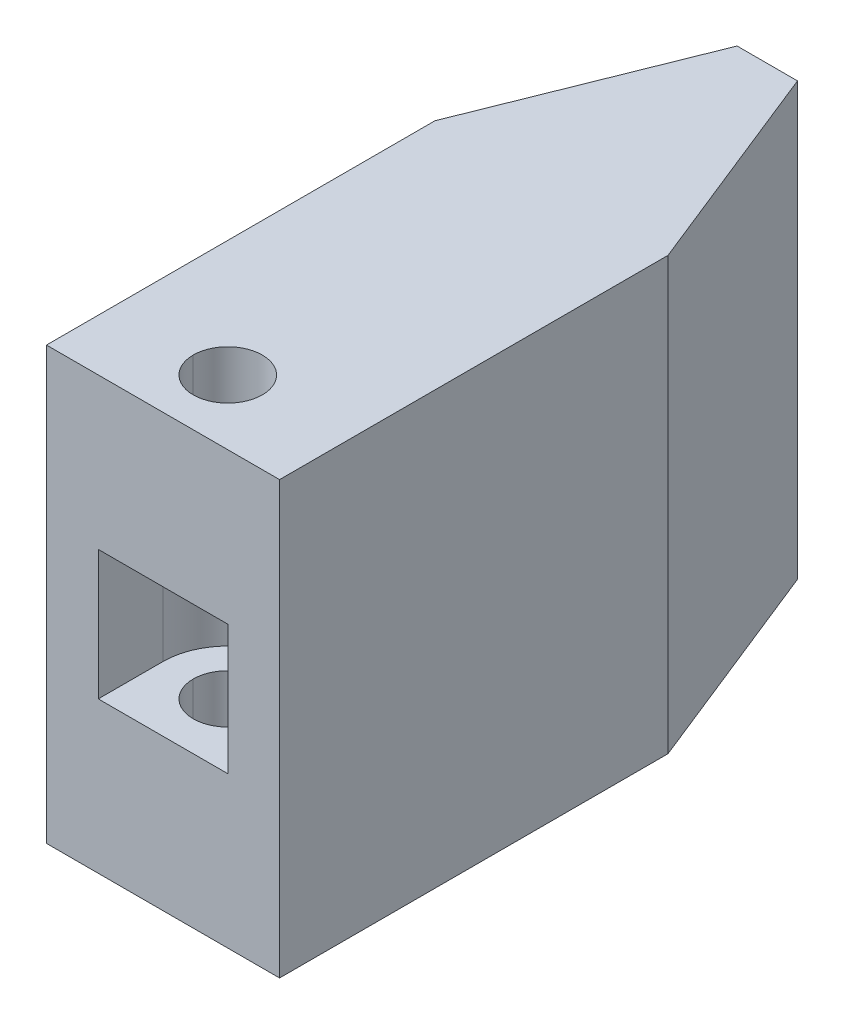
ISO-10303-21;
HEADER;
FILE_DESCRIPTION(('STEP AP214'),'2;1');
FILE_NAME('part.step','',(''),(''),'','','');
FILE_SCHEMA(('AUTOMOTIVE_DESIGN { 1 0 10303 214 1 1 1 1 }'));
ENDSEC;
DATA;
#1=APPLICATION_CONTEXT('core data for automotive mechanical design processes');
#2=APPLICATION_PROTOCOL_DEFINITION('international standard','automotive_design',2000,#1);
#3=PRODUCT_CONTEXT('',#1,'mechanical');
#4=PRODUCT('Part','Part','',(#3));
#5=PRODUCT_RELATED_PRODUCT_CATEGORY('part','',(#4));
#6=PRODUCT_DEFINITION_FORMATION('','',#4);
#7=PRODUCT_DEFINITION_CONTEXT('part definition',#1,'design');
#8=PRODUCT_DEFINITION('design','',#6,#7);
#9=PRODUCT_DEFINITION_SHAPE('','',#8);
#10=(LENGTH_UNIT() NAMED_UNIT(*) SI_UNIT(.MILLI.,.METRE.));
#11=(NAMED_UNIT(*) PLANE_ANGLE_UNIT() SI_UNIT($,.RADIAN.));
#12=(NAMED_UNIT(*) SI_UNIT($,.STERADIAN.) SOLID_ANGLE_UNIT());
#13=UNCERTAINTY_MEASURE_WITH_UNIT(LENGTH_MEASURE(1.E-05),#10,'distance_accuracy_value','');
#14=(GEOMETRIC_REPRESENTATION_CONTEXT(3) GLOBAL_UNCERTAINTY_ASSIGNED_CONTEXT((#13)) GLOBAL_UNIT_ASSIGNED_CONTEXT((#10,
#11,#12)) REPRESENTATION_CONTEXT('',''));
#15=CARTESIAN_POINT('',(0.,0.,0.));
#16=DIRECTION('',(0.,0.,1.));
#17=DIRECTION('',(1.,0.,0.));
#18=AXIS2_PLACEMENT_3D('',#15,#16,#17);
#19=CARTESIAN_POINT('',(-7.5,7.5,35.));
#20=DIRECTION('',(0.,1.,0.));
#21=DIRECTION('',(1.,0.,0.));
#22=AXIS2_PLACEMENT_3D('',#19,#20,#21);
#23=PLANE('',#22);
#24=CARTESIAN_POINT('',(0.,7.5,27.5));
#25=DIRECTION('',(0.,1.,0.));
#26=DIRECTION('',(1.,0.,0.));
#27=AXIS2_PLACEMENT_3D('',#24,#25,#26);
#28=CIRCLE('',#27,4.);
#29=CARTESIAN_POINT('',(4.,7.5,27.5));
#30=VERTEX_POINT('',#29);
#31=CARTESIAN_POINT('',(-4.,7.5,27.5));
#32=VERTEX_POINT('',#31);
#33=EDGE_CURVE('E379',#30,#32,#28,.T.);
#34=ORIENTED_EDGE('',*,*,#33,.T.);
#35=CARTESIAN_POINT('',(0.,7.5,27.5));
#36=DIRECTION('',(0.,1.,0.));
#37=DIRECTION('',(1.,0.,0.));
#38=AXIS2_PLACEMENT_3D('',#35,#36,#37);
#39=CIRCLE('',#38,4.);
#40=EDGE_CURVE('E254',#32,#30,#39,.T.);
#41=ORIENTED_EDGE('',*,*,#40,.T.);
#42=EDGE_LOOP('',(#34,#41));
#43=FACE_BOUND('',#42,.T.);
#44=CARTESIAN_POINT('',(0.,7.5,27.5));
#45=DIRECTION('',(0.,-1.,0.));
#46=DIRECTION('',(1.,0.,0.));
#47=AXIS2_PLACEMENT_3D('',#44,#45,#46);
#48=CIRCLE('',#47,7.5);
#49=CARTESIAN_POINT('',(0.,7.5,20.));
#50=VERTEX_POINT('',#49);
#51=CARTESIAN_POINT('',(7.5,7.5,27.5));
#52=VERTEX_POINT('',#51);
#53=EDGE_CURVE('E248',#50,#52,#48,.T.);
#54=ORIENTED_EDGE('',*,*,#53,.T.);
#55=DIRECTION('',(0.,0.,-1.));
#56=VECTOR('',#55,1.);
#57=CARTESIAN_POINT('',(7.5,7.5,31.25));
#58=LINE('',#57,#56);
#59=CARTESIAN_POINT('',(7.5,7.5,35.));
#60=VERTEX_POINT('',#59);
#61=EDGE_CURVE('E212',#60,#52,#58,.T.);
#62=ORIENTED_EDGE('',*,*,#61,.F.);
#63=DIRECTION('',(-1.,0.,0.));
#64=VECTOR('',#63,1.);
#65=CARTESIAN_POINT('',(0.,7.5,35.));
#66=LINE('',#65,#64);
#67=CARTESIAN_POINT('',(-7.5,7.5,35.));
#68=VERTEX_POINT('',#67);
#69=EDGE_CURVE('E205',#60,#68,#66,.T.);
#70=ORIENTED_EDGE('',*,*,#69,.T.);
#71=DIRECTION('',(0.,0.,-1.));
#72=VECTOR('',#71,1.);
#73=CARTESIAN_POINT('',(-7.5,7.5,31.25));
#74=LINE('',#73,#72);
#75=CARTESIAN_POINT('',(-7.5,7.5,27.5));
#76=VERTEX_POINT('',#75);
#77=EDGE_CURVE('E113',#68,#76,#74,.T.);
#78=ORIENTED_EDGE('',*,*,#77,.T.);
#79=CARTESIAN_POINT('',(0.,7.5,27.5));
#80=DIRECTION('',(0.,-1.,0.));
#81=DIRECTION('',(1.,0.,0.));
#82=AXIS2_PLACEMENT_3D('',#79,#80,#81);
#83=CIRCLE('',#82,7.5);
#84=EDGE_CURVE('E220',#76,#50,#83,.T.);
#85=ORIENTED_EDGE('',*,*,#84,.T.);
#86=EDGE_LOOP('',(#54,#62,#70,#78,#85));
#87=FACE_BOUND('',#86,.T.);
#88=ADVANCED_FACE('F17',(#43,#87),#23,.F.);
#89=CARTESIAN_POINT('',(-3.5,25.,-35.));
#90=DIRECTION('',(0.928476690885259,0.,0.371390676354104));
#91=DIRECTION('',(0.,-1.,0.));
#92=AXIS2_PLACEMENT_3D('',#89,#90,#91);
#93=PLANE('',#92);
#94=DIRECTION('',(-0.371390676354104,0.,0.928476690885259));
#95=VECTOR('',#94,1.);
#96=CARTESIAN_POINT('',(-8.5,-25.,-22.5));
#97=LINE('',#96,#95);
#98=CARTESIAN_POINT('',(-3.5,-25.,-35.));
#99=VERTEX_POINT('',#98);
#100=CARTESIAN_POINT('',(-13.5,-25.,-10.));
#101=VERTEX_POINT('',#100);
#102=EDGE_CURVE('E171',#99,#101,#97,.T.);
#103=ORIENTED_EDGE('',*,*,#102,.T.);
#104=DIRECTION('',(0.,-1.,0.));
#105=VECTOR('',#104,1.);
#106=CARTESIAN_POINT('',(-13.5,0.,-10.));
#107=LINE('',#106,#105);
#108=CARTESIAN_POINT('',(-13.5,25.,-10.));
#109=VERTEX_POINT('',#108);
#110=EDGE_CURVE('E219',#109,#101,#107,.T.);
#111=ORIENTED_EDGE('',*,*,#110,.F.);
#112=DIRECTION('',(0.371390676354104,0.,-0.928476690885259));
#113=VECTOR('',#112,1.);
#114=CARTESIAN_POINT('',(-8.5,25.,-22.5));
#115=LINE('',#114,#113);
#116=CARTESIAN_POINT('',(-3.5,25.,-35.));
#117=VERTEX_POINT('',#116);
#118=EDGE_CURVE('E230',#109,#117,#115,.T.);
#119=ORIENTED_EDGE('',*,*,#118,.T.);
#120=DIRECTION('',(0.,-1.,0.));
#121=VECTOR('',#120,1.);
#122=CARTESIAN_POINT('',(-3.5,0.,-35.));
#123=LINE('',#122,#121);
#124=EDGE_CURVE('E28',#117,#99,#123,.T.);
#125=ORIENTED_EDGE('',*,*,#124,.T.);
#126=EDGE_LOOP('',(#103,#111,#119,#125));
#127=FACE_BOUND('',#126,.T.);
#128=ADVANCED_FACE('F320',(#127),#93,.F.);
#129=CARTESIAN_POINT('',(13.5,0.,0.));
#130=DIRECTION('',(1.,0.,0.));
#131=DIRECTION('',(0.,1.,0.));
#132=AXIS2_PLACEMENT_3D('',#129,#130,#131);
#133=PLANE('',#132);
#134=DIRECTION('',(0.,0.,1.));
#135=VECTOR('',#134,1.);
#136=CARTESIAN_POINT('',(13.5,25.,12.5));
#137=LINE('',#136,#135);
#138=CARTESIAN_POINT('',(13.5,25.,-10.));
#139=VERTEX_POINT('',#138);
#140=CARTESIAN_POINT('',(13.5,25.,35.));
#141=VERTEX_POINT('',#140);
#142=EDGE_CURVE('E177',#139,#141,#137,.T.);
#143=ORIENTED_EDGE('',*,*,#142,.T.);
#144=DIRECTION('',(0.,-1.,0.));
#145=VECTOR('',#144,1.);
#146=CARTESIAN_POINT('',(13.5,0.,35.));
#147=LINE('',#146,#145);
#148=CARTESIAN_POINT('',(13.5,-25.,35.));
#149=VERTEX_POINT('',#148);
#150=EDGE_CURVE('E174',#141,#149,#147,.T.);
#151=ORIENTED_EDGE('',*,*,#150,.T.);
#152=DIRECTION('',(0.,0.,-1.));
#153=VECTOR('',#152,1.);
#154=CARTESIAN_POINT('',(13.5,-25.,12.5));
#155=LINE('',#154,#153);
#156=CARTESIAN_POINT('',(13.5,-25.,-10.));
#157=VERTEX_POINT('',#156);
#158=EDGE_CURVE('E164',#149,#157,#155,.T.);
#159=ORIENTED_EDGE('',*,*,#158,.T.);
#160=DIRECTION('',(0.,-1.,0.));
#161=VECTOR('',#160,1.);
#162=CARTESIAN_POINT('',(13.5,0.,-10.));
#163=LINE('',#162,#161);
#164=EDGE_CURVE('E11',#139,#157,#163,.T.);
#165=ORIENTED_EDGE('',*,*,#164,.F.);
#166=EDGE_LOOP('',(#143,#151,#159,#165));
#167=FACE_BOUND('',#166,.T.);
#168=ADVANCED_FACE('F175',(#167),#133,.T.);
#169=CARTESIAN_POINT('',(3.5,25.,-35.));
#170=DIRECTION('',(0.928476690885259,0.,-0.371390676354104));
#171=DIRECTION('',(0.,-1.,0.));
#172=AXIS2_PLACEMENT_3D('',#169,#170,#171);
#173=PLANE('',#172);
#174=DIRECTION('',(0.,-1.,0.));
#175=VECTOR('',#174,1.);
#176=CARTESIAN_POINT('',(3.5,0.,-35.));
#177=LINE('',#176,#175);
#178=CARTESIAN_POINT('',(3.5,25.,-35.));
#179=VERTEX_POINT('',#178);
#180=CARTESIAN_POINT('',(3.5,-25.,-35.));
#181=VERTEX_POINT('',#180);
#182=EDGE_CURVE('E209',#179,#181,#177,.T.);
#183=ORIENTED_EDGE('',*,*,#182,.F.);
#184=DIRECTION('',(0.371390676354104,0.,0.928476690885259));
#185=VECTOR('',#184,1.);
#186=CARTESIAN_POINT('',(8.5,25.,-22.5));
#187=LINE('',#186,#185);
#188=EDGE_CURVE('E215',#179,#139,#187,.T.);
#189=ORIENTED_EDGE('',*,*,#188,.T.);
#190=ORIENTED_EDGE('',*,*,#164,.T.);
#191=DIRECTION('',(0.371390676354104,0.,0.928476690885259));
#192=VECTOR('',#191,1.);
#193=CARTESIAN_POINT('',(8.5,-25.,-22.5));
#194=LINE('',#193,#192);
#195=EDGE_CURVE('E168',#181,#157,#194,.T.);
#196=ORIENTED_EDGE('',*,*,#195,.F.);
#197=EDGE_LOOP('',(#183,#189,#190,#196));
#198=FACE_BOUND('',#197,.T.);
#199=ADVANCED_FACE('F310',(#198),#173,.T.);
#200=CARTESIAN_POINT('',(0.,25.,-35.));
#201=DIRECTION('',(0.,0.,1.));
#202=DIRECTION('',(1.,0.,0.));
#203=AXIS2_PLACEMENT_3D('',#200,#201,#202);
#204=PLANE('',#203);
#205=DIRECTION('',(1.,0.,0.));
#206=VECTOR('',#205,1.);
#207=CARTESIAN_POINT('',(0.,25.,-35.));
#208=LINE('',#207,#206);
#209=EDGE_CURVE('E285',#117,#179,#208,.T.);
#210=ORIENTED_EDGE('',*,*,#209,.T.);
#211=ORIENTED_EDGE('',*,*,#182,.T.);
#212=DIRECTION('',(1.,0.,0.));
#213=VECTOR('',#212,1.);
#214=CARTESIAN_POINT('',(0.,-25.,-35.));
#215=LINE('',#214,#213);
#216=EDGE_CURVE('E269',#99,#181,#215,.T.);
#217=ORIENTED_EDGE('',*,*,#216,.F.);
#218=ORIENTED_EDGE('',*,*,#124,.F.);
#219=EDGE_LOOP('',(#210,#211,#217,#218));
#220=FACE_BOUND('',#219,.T.);
#221=ADVANCED_FACE('F307',(#220),#204,.F.);
#222=CARTESIAN_POINT('',(0.,-25.,35.));
#223=DIRECTION('',(0.,-1.,0.));
#224=DIRECTION('',(0.,0.,-1.));
#225=AXIS2_PLACEMENT_3D('',#222,#223,#224);
#226=PLANE('',#225);
#227=CARTESIAN_POINT('',(0.,-25.,27.5));
#228=DIRECTION('',(0.,-1.,0.));
#229=DIRECTION('',(1.,0.,0.));
#230=AXIS2_PLACEMENT_3D('',#227,#228,#229);
#231=CIRCLE('',#230,4.);
#232=CARTESIAN_POINT('',(4.,-25.,27.5));
#233=VERTEX_POINT('',#232);
#234=CARTESIAN_POINT('',(-4.,-25.,27.5));
#235=VERTEX_POINT('',#234);
#236=EDGE_CURVE('E253',#233,#235,#231,.T.);
#237=ORIENTED_EDGE('',*,*,#236,.F.);
#238=CARTESIAN_POINT('',(0.,-25.,27.5));
#239=DIRECTION('',(0.,-1.,0.));
#240=DIRECTION('',(1.,0.,0.));
#241=AXIS2_PLACEMENT_3D('',#238,#239,#240);
#242=CIRCLE('',#241,4.);
#243=EDGE_CURVE('E198',#235,#233,#242,.T.);
#244=ORIENTED_EDGE('',*,*,#243,.F.);
#245=EDGE_LOOP('',(#237,#244));
#246=FACE_BOUND('',#245,.T.);
#247=ORIENTED_EDGE('',*,*,#216,.T.);
#248=ORIENTED_EDGE('',*,*,#195,.T.);
#249=ORIENTED_EDGE('',*,*,#158,.F.);
#250=DIRECTION('',(1.,0.,0.));
#251=VECTOR('',#250,1.);
#252=CARTESIAN_POINT('',(0.,-25.,35.));
#253=LINE('',#252,#251);
#254=CARTESIAN_POINT('',(-13.5,-25.,35.));
#255=VERTEX_POINT('',#254);
#256=EDGE_CURVE('E159',#255,#149,#253,.T.);
#257=ORIENTED_EDGE('',*,*,#256,.F.);
#258=DIRECTION('',(0.,0.,-1.));
#259=VECTOR('',#258,1.);
#260=CARTESIAN_POINT('',(-13.5,-25.,12.5));
#261=LINE('',#260,#259);
#262=EDGE_CURVE('E193',#255,#101,#261,.T.);
#263=ORIENTED_EDGE('',*,*,#262,.T.);
#264=ORIENTED_EDGE('',*,*,#102,.F.);
#265=EDGE_LOOP('',(#247,#248,#249,#257,#263,#264));
#266=FACE_BOUND('',#265,.T.);
#267=ADVANCED_FACE('F167',(#246,#266),#226,.T.);
#268=CARTESIAN_POINT('',(-7.5,7.5,35.));
#269=DIRECTION('',(1.,0.,0.));
#270=DIRECTION('',(0.,1.,0.));
#271=AXIS2_PLACEMENT_3D('',#268,#269,#270);
#272=PLANE('',#271);
#273=ORIENTED_EDGE('',*,*,#77,.F.);
#274=DIRECTION('',(0.,-1.,0.));
#275=VECTOR('',#274,1.);
#276=CARTESIAN_POINT('',(-7.5,0.,35.));
#277=LINE('',#276,#275);
#278=CARTESIAN_POINT('',(-7.5,-7.5,35.));
#279=VERTEX_POINT('',#278);
#280=EDGE_CURVE('E202',#68,#279,#277,.T.);
#281=ORIENTED_EDGE('',*,*,#280,.T.);
#282=DIRECTION('',(0.,0.,-1.));
#283=VECTOR('',#282,1.);
#284=CARTESIAN_POINT('',(-7.5,-7.5,31.25));
#285=LINE('',#284,#283);
#286=CARTESIAN_POINT('',(-7.5,-7.5,27.5));
#287=VERTEX_POINT('',#286);
#288=EDGE_CURVE('E103',#279,#287,#285,.T.);
#289=ORIENTED_EDGE('',*,*,#288,.T.);
#290=DIRECTION('',(0.,1.,0.));
#291=VECTOR('',#290,1.);
#292=CARTESIAN_POINT('',(-7.5,0.,27.5));
#293=LINE('',#292,#291);
#294=EDGE_CURVE('E21',#287,#76,#293,.T.);
#295=ORIENTED_EDGE('',*,*,#294,.T.);
#296=EDGE_LOOP('',(#273,#281,#289,#295));
#297=FACE_BOUND('',#296,.T.);
#298=ADVANCED_FACE('F420',(#297),#272,.T.);
#299=CARTESIAN_POINT('',(7.5,-7.5,35.));
#300=DIRECTION('',(0.,-1.,0.));
#301=DIRECTION('',(0.,0.,-1.));
#302=AXIS2_PLACEMENT_3D('',#299,#300,#301);
#303=PLANE('',#302);
#304=CARTESIAN_POINT('',(0.,-7.5,27.5));
#305=DIRECTION('',(0.,-1.,0.));
#306=DIRECTION('',(1.,0.,0.));
#307=AXIS2_PLACEMENT_3D('',#304,#305,#306);
#308=CIRCLE('',#307,4.);
#309=CARTESIAN_POINT('',(-4.,-7.5,27.5));
#310=VERTEX_POINT('',#309);
#311=CARTESIAN_POINT('',(4.,-7.5,27.5));
#312=VERTEX_POINT('',#311);
#313=EDGE_CURVE('E249',#310,#312,#308,.T.);
#314=ORIENTED_EDGE('',*,*,#313,.T.);
#315=CARTESIAN_POINT('',(0.,-7.5,27.5));
#316=DIRECTION('',(0.,-1.,0.));
#317=DIRECTION('',(1.,0.,0.));
#318=AXIS2_PLACEMENT_3D('',#315,#316,#317);
#319=CIRCLE('',#318,4.);
#320=EDGE_CURVE('E244',#312,#310,#319,.T.);
#321=ORIENTED_EDGE('',*,*,#320,.T.);
#322=EDGE_LOOP('',(#314,#321));
#323=FACE_BOUND('',#322,.T.);
#324=CARTESIAN_POINT('',(0.,-7.5,27.5));
#325=DIRECTION('',(0.,1.,0.));
#326=DIRECTION('',(1.,0.,0.));
#327=AXIS2_PLACEMENT_3D('',#324,#325,#326);
#328=CIRCLE('',#327,7.5);
#329=CARTESIAN_POINT('',(7.5,-7.5,27.5));
#330=VERTEX_POINT('',#329);
#331=CARTESIAN_POINT('',(0.,-7.5,20.));
#332=VERTEX_POINT('',#331);
#333=EDGE_CURVE('E234',#330,#332,#328,.T.);
#334=ORIENTED_EDGE('',*,*,#333,.T.);
#335=CARTESIAN_POINT('',(0.,-7.5,27.5));
#336=DIRECTION('',(0.,1.,0.));
#337=DIRECTION('',(1.,0.,0.));
#338=AXIS2_PLACEMENT_3D('',#335,#336,#337);
#339=CIRCLE('',#338,7.5);
#340=EDGE_CURVE('E275',#332,#287,#339,.T.);
#341=ORIENTED_EDGE('',*,*,#340,.T.);
#342=ORIENTED_EDGE('',*,*,#288,.F.);
#343=DIRECTION('',(1.,0.,0.));
#344=VECTOR('',#343,1.);
#345=CARTESIAN_POINT('',(0.,-7.5,35.));
#346=LINE('',#345,#344);
#347=CARTESIAN_POINT('',(7.5,-7.5,35.));
#348=VERTEX_POINT('',#347);
#349=EDGE_CURVE('E206',#279,#348,#346,.T.);
#350=ORIENTED_EDGE('',*,*,#349,.T.);
#351=DIRECTION('',(0.,0.,-1.));
#352=VECTOR('',#351,1.);
#353=CARTESIAN_POINT('',(7.5,-7.5,31.25));
#354=LINE('',#353,#352);
#355=EDGE_CURVE('E241',#348,#330,#354,.T.);
#356=ORIENTED_EDGE('',*,*,#355,.T.);
#357=EDGE_LOOP('',(#334,#341,#342,#350,#356));
#358=FACE_BOUND('',#357,.T.);
#359=ADVANCED_FACE('F369',(#323,#358),#303,.F.);
#360=CARTESIAN_POINT('',(7.5,-7.5,35.));
#361=DIRECTION('',(-1.,0.,0.));
#362=DIRECTION('',(0.,0.,1.));
#363=AXIS2_PLACEMENT_3D('',#360,#361,#362);
#364=PLANE('',#363);
#365=ORIENTED_EDGE('',*,*,#355,.F.);
#366=DIRECTION('',(0.,1.,0.));
#367=VECTOR('',#366,1.);
#368=CARTESIAN_POINT('',(7.5,0.,35.));
#369=LINE('',#368,#367);
#370=EDGE_CURVE('E182',#348,#60,#369,.T.);
#371=ORIENTED_EDGE('',*,*,#370,.T.);
#372=ORIENTED_EDGE('',*,*,#61,.T.);
#373=DIRECTION('',(0.,-1.,0.));
#374=VECTOR('',#373,1.);
#375=CARTESIAN_POINT('',(7.5,0.,27.5));
#376=LINE('',#375,#374);
#377=EDGE_CURVE('E224',#52,#330,#376,.T.);
#378=ORIENTED_EDGE('',*,*,#377,.T.);
#379=EDGE_LOOP('',(#365,#371,#372,#378));
#380=FACE_BOUND('',#379,.T.);
#381=ADVANCED_FACE('F360',(#380),#364,.T.);
#382=CARTESIAN_POINT('',(0.,-0.66000000039,27.5));
#383=DIRECTION('',(0.,1.,0.));
#384=DIRECTION('',(-1.,0.,0.));
#385=AXIS2_PLACEMENT_3D('',#382,#383,#384);
#386=CYLINDRICAL_SURFACE('',#385,4.);
#387=DIRECTION('',(0.,-1.,0.));
#388=VECTOR('',#387,1.);
#389=CARTESIAN_POINT('',(4.,-0.66000000039,27.5));
#390=LINE('',#389,#388);
#391=EDGE_CURVE('E196',#312,#233,#390,.T.);
#392=ORIENTED_EDGE('',*,*,#391,.T.);
#393=ORIENTED_EDGE('',*,*,#236,.T.);
#394=DIRECTION('',(0.,-1.,0.));
#395=VECTOR('',#394,1.);
#396=CARTESIAN_POINT('',(-4.,-0.66000000039,27.5));
#397=LINE('',#396,#395);
#398=EDGE_CURVE('E201',#310,#235,#397,.T.);
#399=ORIENTED_EDGE('',*,*,#398,.F.);
#400=ORIENTED_EDGE('',*,*,#320,.F.);
#401=EDGE_LOOP('',(#392,#393,#399,#400));
#402=FACE_BOUND('',#401,.T.);
#403=ADVANCED_FACE('F354',(#402),#386,.F.);
#404=CARTESIAN_POINT('',(0.,-0.66000000039,27.5));
#405=DIRECTION('',(0.,1.,0.));
#406=DIRECTION('',(-1.,0.,0.));
#407=AXIS2_PLACEMENT_3D('',#404,#405,#406);
#408=CYLINDRICAL_SURFACE('',#407,4.);
#409=ORIENTED_EDGE('',*,*,#398,.T.);
#410=ORIENTED_EDGE('',*,*,#243,.T.);
#411=ORIENTED_EDGE('',*,*,#391,.F.);
#412=ORIENTED_EDGE('',*,*,#313,.F.);
#413=EDGE_LOOP('',(#409,#410,#411,#412));
#414=FACE_BOUND('',#413,.T.);
#415=ADVANCED_FACE('F345',(#414),#408,.F.);
#416=CARTESIAN_POINT('',(0.,0.,27.5));
#417=DIRECTION('',(0.,1.,0.));
#418=DIRECTION('',(1.,0.,0.));
#419=AXIS2_PLACEMENT_3D('',#416,#417,#418);
#420=CYLINDRICAL_SURFACE('',#419,7.5);
#421=ORIENTED_EDGE('',*,*,#377,.F.);
#422=ORIENTED_EDGE('',*,*,#53,.F.);
#423=DIRECTION('',(0.,-1.,0.));
#424=VECTOR('',#423,1.);
#425=CARTESIAN_POINT('',(0.,0.,20.));
#426=LINE('',#425,#424);
#427=EDGE_CURVE('E225',#50,#332,#426,.T.);
#428=ORIENTED_EDGE('',*,*,#427,.T.);
#429=ORIENTED_EDGE('',*,*,#333,.F.);
#430=EDGE_LOOP('',(#421,#422,#428,#429));
#431=FACE_BOUND('',#430,.T.);
#432=ADVANCED_FACE('F342',(#431),#420,.F.);
#433=CARTESIAN_POINT('',(0.,0.,27.5));
#434=DIRECTION('',(0.,-1.,0.));
#435=DIRECTION('',(-1.,0.,0.));
#436=AXIS2_PLACEMENT_3D('',#433,#434,#435);
#437=CYLINDRICAL_SURFACE('',#436,7.5);
#438=ORIENTED_EDGE('',*,*,#294,.F.);
#439=ORIENTED_EDGE('',*,*,#340,.F.);
#440=ORIENTED_EDGE('',*,*,#427,.F.);
#441=ORIENTED_EDGE('',*,*,#84,.F.);
#442=EDGE_LOOP('',(#438,#439,#440,#441));
#443=FACE_BOUND('',#442,.T.);
#444=ADVANCED_FACE('F344',(#443),#437,.F.);
#445=CARTESIAN_POINT('',(0.,-25.,35.));
#446=DIRECTION('',(0.,0.,-1.));
#447=DIRECTION('',(0.,-1.,0.));
#448=AXIS2_PLACEMENT_3D('',#445,#446,#447);
#449=PLANE('',#448);
#450=ORIENTED_EDGE('',*,*,#370,.F.);
#451=ORIENTED_EDGE('',*,*,#349,.F.);
#452=ORIENTED_EDGE('',*,*,#280,.F.);
#453=ORIENTED_EDGE('',*,*,#69,.F.);
#454=EDGE_LOOP('',(#450,#451,#452,#453));
#455=FACE_BOUND('',#454,.T.);
#456=DIRECTION('',(1.,0.,0.));
#457=VECTOR('',#456,1.);
#458=CARTESIAN_POINT('',(0.,25.,35.));
#459=LINE('',#458,#457);
#460=CARTESIAN_POINT('',(-13.5,25.,35.));
#461=VERTEX_POINT('',#460);
#462=EDGE_CURVE('E216',#461,#141,#459,.T.);
#463=ORIENTED_EDGE('',*,*,#462,.F.);
#464=DIRECTION('',(0.,-1.,0.));
#465=VECTOR('',#464,1.);
#466=CARTESIAN_POINT('',(-13.5,0.,35.));
#467=LINE('',#466,#465);
#468=EDGE_CURVE('E185',#461,#255,#467,.T.);
#469=ORIENTED_EDGE('',*,*,#468,.T.);
#470=ORIENTED_EDGE('',*,*,#256,.T.);
#471=ORIENTED_EDGE('',*,*,#150,.F.);
#472=EDGE_LOOP('',(#463,#469,#470,#471));
#473=FACE_BOUND('',#472,.T.);
#474=ADVANCED_FACE('F184',(#455,#473),#449,.F.);
#475=CARTESIAN_POINT('',(-13.5,0.,0.));
#476=DIRECTION('',(1.,0.,0.));
#477=DIRECTION('',(0.,1.,0.));
#478=AXIS2_PLACEMENT_3D('',#475,#476,#477);
#479=PLANE('',#478);
#480=ORIENTED_EDGE('',*,*,#110,.T.);
#481=ORIENTED_EDGE('',*,*,#262,.F.);
#482=ORIENTED_EDGE('',*,*,#468,.F.);
#483=DIRECTION('',(0.,0.,1.));
#484=VECTOR('',#483,1.);
#485=CARTESIAN_POINT('',(-13.5,25.,12.5));
#486=LINE('',#485,#484);
#487=EDGE_CURVE('E226',#109,#461,#486,.T.);
#488=ORIENTED_EDGE('',*,*,#487,.F.);
#489=EDGE_LOOP('',(#480,#481,#482,#488));
#490=FACE_BOUND('',#489,.T.);
#491=ADVANCED_FACE('F301',(#490),#479,.F.);
#492=CARTESIAN_POINT('',(0.,25.,-35.));
#493=DIRECTION('',(0.,1.,0.));
#494=DIRECTION('',(1.,0.,0.));
#495=AXIS2_PLACEMENT_3D('',#492,#493,#494);
#496=PLANE('',#495);
#497=CARTESIAN_POINT('',(0.,25.,27.5));
#498=DIRECTION('',(0.,1.,0.));
#499=DIRECTION('',(1.,0.,0.));
#500=AXIS2_PLACEMENT_3D('',#497,#498,#499);
#501=CIRCLE('',#500,4.);
#502=CARTESIAN_POINT('',(-4.,25.,27.5));
#503=VERTEX_POINT('',#502);
#504=CARTESIAN_POINT('',(4.,25.,27.5));
#505=VERTEX_POINT('',#504);
#506=EDGE_CURVE('E257',#503,#505,#501,.T.);
#507=ORIENTED_EDGE('',*,*,#506,.F.);
#508=CARTESIAN_POINT('',(0.,25.,27.5));
#509=DIRECTION('',(0.,1.,0.));
#510=DIRECTION('',(1.,0.,0.));
#511=AXIS2_PLACEMENT_3D('',#508,#509,#510);
#512=CIRCLE('',#511,4.);
#513=EDGE_CURVE('E235',#505,#503,#512,.T.);
#514=ORIENTED_EDGE('',*,*,#513,.F.);
#515=EDGE_LOOP('',(#507,#514));
#516=FACE_BOUND('',#515,.T.);
#517=ORIENTED_EDGE('',*,*,#118,.F.);
#518=ORIENTED_EDGE('',*,*,#487,.T.);
#519=ORIENTED_EDGE('',*,*,#462,.T.);
#520=ORIENTED_EDGE('',*,*,#142,.F.);
#521=ORIENTED_EDGE('',*,*,#188,.F.);
#522=ORIENTED_EDGE('',*,*,#209,.F.);
#523=EDGE_LOOP('',(#517,#518,#519,#520,#521,#522));
#524=FACE_BOUND('',#523,.T.);
#525=ADVANCED_FACE('F19',(#516,#524),#496,.T.);
#526=CARTESIAN_POINT('',(0.,-0.66000000039,27.5));
#527=DIRECTION('',(0.,1.,0.));
#528=DIRECTION('',(-1.,0.,0.));
#529=AXIS2_PLACEMENT_3D('',#526,#527,#528);
#530=CYLINDRICAL_SURFACE('',#529,4.);
#531=ORIENTED_EDGE('',*,*,#40,.F.);
#532=DIRECTION('',(0.,-1.,0.));
#533=VECTOR('',#532,1.);
#534=CARTESIAN_POINT('',(-4.,-0.66000000039,27.5));
#535=LINE('',#534,#533);
#536=EDGE_CURVE('E239',#503,#32,#535,.T.);
#537=ORIENTED_EDGE('',*,*,#536,.F.);
#538=ORIENTED_EDGE('',*,*,#506,.T.);
#539=DIRECTION('',(0.,-1.,0.));
#540=VECTOR('',#539,1.);
#541=CARTESIAN_POINT('',(4.,-0.66000000039,27.5));
#542=LINE('',#541,#540);
#543=EDGE_CURVE('E240',#505,#30,#542,.T.);
#544=ORIENTED_EDGE('',*,*,#543,.T.);
#545=EDGE_LOOP('',(#531,#537,#538,#544));
#546=FACE_BOUND('',#545,.T.);
#547=ADVANCED_FACE('F338',(#546),#530,.F.);
#548=CARTESIAN_POINT('',(0.,-0.66000000039,27.5));
#549=DIRECTION('',(0.,1.,0.));
#550=DIRECTION('',(-1.,0.,0.));
#551=AXIS2_PLACEMENT_3D('',#548,#549,#550);
#552=CYLINDRICAL_SURFACE('',#551,4.);
#553=ORIENTED_EDGE('',*,*,#33,.F.);
#554=ORIENTED_EDGE('',*,*,#543,.F.);
#555=ORIENTED_EDGE('',*,*,#513,.T.);
#556=ORIENTED_EDGE('',*,*,#536,.T.);
#557=EDGE_LOOP('',(#553,#554,#555,#556));
#558=FACE_BOUND('',#557,.T.);
#559=ADVANCED_FACE('F340',(#558),#552,.F.);
#560=CLOSED_SHELL('',(#88,#128,#168,#199,#221,#267,#298,#359,#381,#403,#415,#432,#444,#474,#491,
#525,#547,#559));
#561=MANIFOLD_SOLID_BREP('B1',#560);
#562=ADVANCED_BREP_SHAPE_REPRESENTATION('',(#18,#561),#14);
#563=SHAPE_DEFINITION_REPRESENTATION(#9,#562);
ENDSEC;
END-ISO-10303-21;
